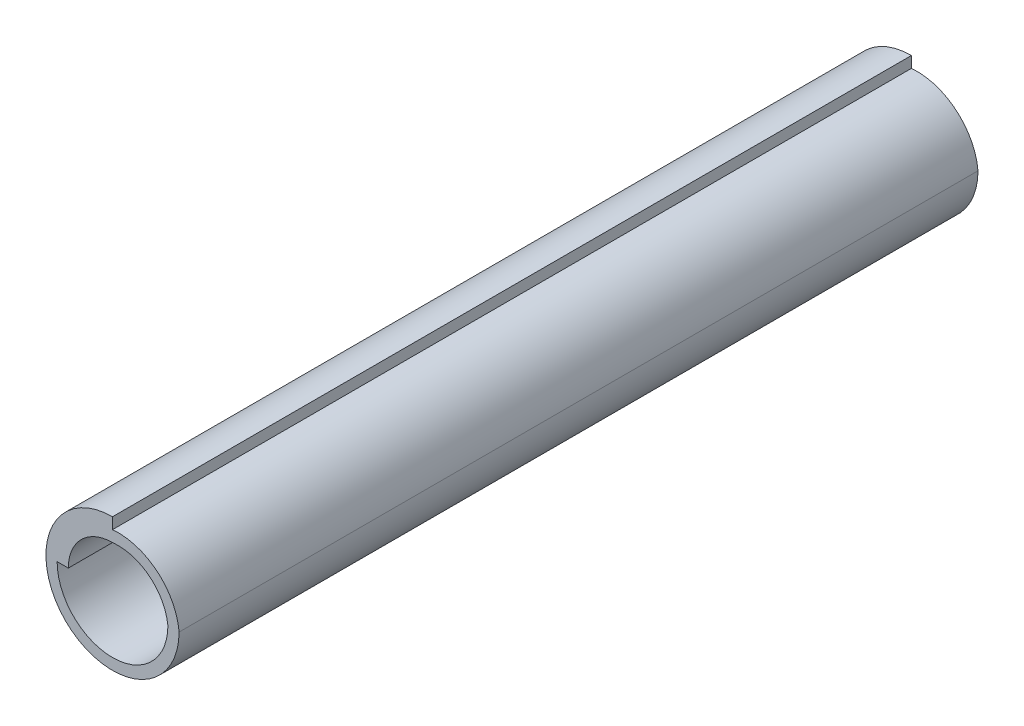
ISO-10303-21;
HEADER;
FILE_DESCRIPTION(('STEP AP214'),'2;1');
FILE_NAME('part.step','',(''),(''),'','','');
FILE_SCHEMA(('AUTOMOTIVE_DESIGN { 1 0 10303 214 1 1 1 1 }'));
ENDSEC;
DATA;
#1=APPLICATION_CONTEXT('core data for automotive mechanical design processes');
#2=APPLICATION_PROTOCOL_DEFINITION('international standard','automotive_design',2000,#1);
#3=PRODUCT_CONTEXT('',#1,'mechanical');
#4=PRODUCT('Part','Part','',(#3));
#5=PRODUCT_RELATED_PRODUCT_CATEGORY('part','',(#4));
#6=PRODUCT_DEFINITION_FORMATION('','',#4);
#7=PRODUCT_DEFINITION_CONTEXT('part definition',#1,'design');
#8=PRODUCT_DEFINITION('design','',#6,#7);
#9=PRODUCT_DEFINITION_SHAPE('','',#8);
#10=(LENGTH_UNIT() NAMED_UNIT(*) SI_UNIT(.MILLI.,.METRE.));
#11=(NAMED_UNIT(*) PLANE_ANGLE_UNIT() SI_UNIT($,.RADIAN.));
#12=(NAMED_UNIT(*) SI_UNIT($,.STERADIAN.) SOLID_ANGLE_UNIT());
#13=UNCERTAINTY_MEASURE_WITH_UNIT(LENGTH_MEASURE(1.E-05),#10,'distance_accuracy_value','');
#14=(GEOMETRIC_REPRESENTATION_CONTEXT(3) GLOBAL_UNCERTAINTY_ASSIGNED_CONTEXT((#13)) GLOBAL_UNIT_ASSIGNED_CONTEXT((#10,
#11,#12)) REPRESENTATION_CONTEXT('',''));
#15=CARTESIAN_POINT('',(0.,0.,0.));
#16=DIRECTION('',(0.,0.,1.));
#17=DIRECTION('',(1.,0.,0.));
#18=AXIS2_PLACEMENT_3D('',#15,#16,#17);
#19=CARTESIAN_POINT('',(0.209999999999992,-0.21000000000001,15.));
#20=DIRECTION('',(0.,0.,1.));
#21=DIRECTION('',(1.,0.,0.));
#22=AXIS2_PLACEMENT_3D('',#19,#20,#21);
#23=PLANE('',#22);
#24=CARTESIAN_POINT('',(0.209999999999992,-0.21000000000001,15.));
#25=DIRECTION('',(0.,0.,1.));
#26=DIRECTION('',(1.,0.,0.));
#27=AXIS2_PLACEMENT_3D('',#24,#25,#26);
#28=CIRCLE('',#27,2.29960866235976);
#29=CARTESIAN_POINT('',(2.5,0.,15.));
#30=VERTEX_POINT('',#29);
#31=CARTESIAN_POINT('',(0.,2.08,15.));
#32=VERTEX_POINT('',#31);
#33=EDGE_CURVE('E127',#30,#32,#28,.T.);
#34=ORIENTED_EDGE('',*,*,#33,.T.);
#35=DIRECTION('',(0.,1.,0.));
#36=VECTOR('',#35,1.);
#37=CARTESIAN_POINT('',(0.,2.08,15.));
#38=LINE('',#37,#36);
#39=CARTESIAN_POINT('',(0.,2.5,15.));
#40=VERTEX_POINT('',#39);
#41=EDGE_CURVE('E130',#32,#40,#38,.T.);
#42=ORIENTED_EDGE('',*,*,#41,.T.);
#43=CARTESIAN_POINT('',(0.,0.,15.));
#44=DIRECTION('',(0.,0.,1.));
#45=DIRECTION('',(1.,0.,0.));
#46=AXIS2_PLACEMENT_3D('',#43,#44,#45);
#47=CIRCLE('',#46,2.5);
#48=EDGE_CURVE('E133',#40,#30,#47,.T.);
#49=ORIENTED_EDGE('',*,*,#48,.T.);
#50=EDGE_LOOP('',(#34,#42,#49));
#51=FACE_BOUND('',#50,.T.);
#52=CARTESIAN_POINT('',(0.209999999999992,-0.21000000000001,15.));
#53=DIRECTION('',(0.,0.,1.));
#54=DIRECTION('',(1.,0.,0.));
#55=AXIS2_PLACEMENT_3D('',#52,#53,#54);
#56=CIRCLE('',#55,1.88175450045962);
#57=CARTESIAN_POINT('',(2.08,0.,15.));
#58=VERTEX_POINT('',#57);
#59=CARTESIAN_POINT('',(0.,1.66,15.));
#60=VERTEX_POINT('',#59);
#61=EDGE_CURVE('E99',#58,#60,#56,.T.);
#62=ORIENTED_EDGE('',*,*,#61,.F.);
#63=CARTESIAN_POINT('',(0.,0.,15.));
#64=DIRECTION('',(0.,0.,1.));
#65=DIRECTION('',(1.,0.,0.));
#66=AXIS2_PLACEMENT_3D('',#63,#64,#65);
#67=CIRCLE('',#66,2.08);
#68=CARTESIAN_POINT('',(-2.08,0.,15.));
#69=VERTEX_POINT('',#68);
#70=EDGE_CURVE('E91',#69,#58,#67,.T.);
#71=ORIENTED_EDGE('',*,*,#70,.F.);
#72=DIRECTION('',(-1.,0.,0.));
#73=VECTOR('',#72,1.);
#74=CARTESIAN_POINT('',(-2.08,0.,15.));
#75=LINE('',#74,#73);
#76=CARTESIAN_POINT('',(-1.66,0.,15.));
#77=VERTEX_POINT('',#76);
#78=EDGE_CURVE('E113',#77,#69,#75,.T.);
#79=ORIENTED_EDGE('',*,*,#78,.F.);
#80=CARTESIAN_POINT('',(0.,0.,15.));
#81=DIRECTION('',(0.,0.,1.));
#82=DIRECTION('',(1.,0.,0.));
#83=AXIS2_PLACEMENT_3D('',#80,#81,#82);
#84=CIRCLE('',#83,1.66);
#85=EDGE_CURVE('E111',#60,#77,#84,.T.);
#86=ORIENTED_EDGE('',*,*,#85,.F.);
#87=EDGE_LOOP('',(#62,#71,#79,#86));
#88=FACE_BOUND('',#87,.T.);
#89=ADVANCED_FACE('F32',(#51,#88),#23,.T.);
#90=CARTESIAN_POINT('',(0.209999999999992,-0.21000000000001,-15.));
#91=DIRECTION('',(0.,0.,1.));
#92=DIRECTION('',(1.,0.,0.));
#93=AXIS2_PLACEMENT_3D('',#90,#91,#92);
#94=PLANE('',#93);
#95=CARTESIAN_POINT('',(0.209999999999992,-0.21000000000001,-15.));
#96=DIRECTION('',(0.,0.,1.));
#97=DIRECTION('',(1.,0.,0.));
#98=AXIS2_PLACEMENT_3D('',#95,#96,#97);
#99=CIRCLE('',#98,2.29960866235976);
#100=CARTESIAN_POINT('',(2.5,0.,-15.));
#101=VERTEX_POINT('',#100);
#102=CARTESIAN_POINT('',(0.,2.08,-15.));
#103=VERTEX_POINT('',#102);
#104=EDGE_CURVE('E107',#101,#103,#99,.T.);
#105=ORIENTED_EDGE('',*,*,#104,.F.);
#106=CARTESIAN_POINT('',(0.,0.,-15.));
#107=DIRECTION('',(0.,0.,1.));
#108=DIRECTION('',(1.,0.,0.));
#109=AXIS2_PLACEMENT_3D('',#106,#107,#108);
#110=CIRCLE('',#109,2.5);
#111=CARTESIAN_POINT('',(0.,2.5,-15.));
#112=VERTEX_POINT('',#111);
#113=EDGE_CURVE('E131',#112,#101,#110,.T.);
#114=ORIENTED_EDGE('',*,*,#113,.F.);
#115=DIRECTION('',(0.,1.,0.));
#116=VECTOR('',#115,1.);
#117=CARTESIAN_POINT('',(0.,2.08,-15.));
#118=LINE('',#117,#116);
#119=EDGE_CURVE('E138',#103,#112,#118,.T.);
#120=ORIENTED_EDGE('',*,*,#119,.F.);
#121=EDGE_LOOP('',(#105,#114,#120));
#122=FACE_BOUND('',#121,.T.);
#123=CARTESIAN_POINT('',(0.,0.,-15.));
#124=DIRECTION('',(0.,0.,1.));
#125=DIRECTION('',(1.,0.,0.));
#126=AXIS2_PLACEMENT_3D('',#123,#124,#125);
#127=CIRCLE('',#126,2.08);
#128=CARTESIAN_POINT('',(-2.08,0.,-15.));
#129=VERTEX_POINT('',#128);
#130=CARTESIAN_POINT('',(2.08,0.,-15.));
#131=VERTEX_POINT('',#130);
#132=EDGE_CURVE('E55',#129,#131,#127,.T.);
#133=ORIENTED_EDGE('',*,*,#132,.T.);
#134=CARTESIAN_POINT('',(0.209999999999992,-0.21000000000001,-15.));
#135=DIRECTION('',(0.,0.,1.));
#136=DIRECTION('',(1.,0.,0.));
#137=AXIS2_PLACEMENT_3D('',#134,#135,#136);
#138=CIRCLE('',#137,1.88175450045962);
#139=CARTESIAN_POINT('',(0.,1.66,-15.));
#140=VERTEX_POINT('',#139);
#141=EDGE_CURVE('E106',#131,#140,#138,.T.);
#142=ORIENTED_EDGE('',*,*,#141,.T.);
#143=CARTESIAN_POINT('',(0.,0.,-15.));
#144=DIRECTION('',(0.,0.,1.));
#145=DIRECTION('',(1.,0.,0.));
#146=AXIS2_PLACEMENT_3D('',#143,#144,#145);
#147=CIRCLE('',#146,1.66);
#148=CARTESIAN_POINT('',(-1.66,0.,-15.));
#149=VERTEX_POINT('',#148);
#150=EDGE_CURVE('E119',#140,#149,#147,.T.);
#151=ORIENTED_EDGE('',*,*,#150,.T.);
#152=DIRECTION('',(-1.,0.,0.));
#153=VECTOR('',#152,1.);
#154=CARTESIAN_POINT('',(-2.08,0.,-15.));
#155=LINE('',#154,#153);
#156=EDGE_CURVE('E100',#149,#129,#155,.T.);
#157=ORIENTED_EDGE('',*,*,#156,.T.);
#158=EDGE_LOOP('',(#133,#142,#151,#157));
#159=FACE_BOUND('',#158,.T.);
#160=ADVANCED_FACE('F152',(#122,#159),#94,.F.);
#161=CARTESIAN_POINT('',(0.209999999999992,-0.21000000000001,15.));
#162=DIRECTION('',(0.,0.,-1.));
#163=DIRECTION('',(-1.,0.,0.));
#164=AXIS2_PLACEMENT_3D('',#161,#162,#163);
#165=CYLINDRICAL_SURFACE('',#164,2.29960866235976);
#166=ORIENTED_EDGE('',*,*,#104,.T.);
#167=DIRECTION('',(0.,0.,-1.));
#168=VECTOR('',#167,1.);
#169=CARTESIAN_POINT('',(0.,2.08,15.));
#170=LINE('',#169,#168);
#171=EDGE_CURVE('E11',#32,#103,#170,.T.);
#172=ORIENTED_EDGE('',*,*,#171,.F.);
#173=ORIENTED_EDGE('',*,*,#33,.F.);
#174=DIRECTION('',(0.,0.,-1.));
#175=VECTOR('',#174,1.);
#176=CARTESIAN_POINT('',(2.5,0.,15.));
#177=LINE('',#176,#175);
#178=EDGE_CURVE('E135',#30,#101,#177,.T.);
#179=ORIENTED_EDGE('',*,*,#178,.T.);
#180=EDGE_LOOP('',(#166,#172,#173,#179));
#181=FACE_BOUND('',#180,.T.);
#182=ADVANCED_FACE('F34',(#181),#165,.T.);
#183=CARTESIAN_POINT('',(0.,2.08,15.));
#184=DIRECTION('',(-1.,0.,0.));
#185=DIRECTION('',(0.,0.,1.));
#186=AXIS2_PLACEMENT_3D('',#183,#184,#185);
#187=PLANE('',#186);
#188=ORIENTED_EDGE('',*,*,#119,.T.);
#189=DIRECTION('',(0.,0.,-1.));
#190=VECTOR('',#189,1.);
#191=CARTESIAN_POINT('',(0.,2.5,15.));
#192=LINE('',#191,#190);
#193=EDGE_CURVE('E40',#40,#112,#192,.T.);
#194=ORIENTED_EDGE('',*,*,#193,.F.);
#195=ORIENTED_EDGE('',*,*,#41,.F.);
#196=ORIENTED_EDGE('',*,*,#171,.T.);
#197=EDGE_LOOP('',(#188,#194,#195,#196));
#198=FACE_BOUND('',#197,.T.);
#199=ADVANCED_FACE('F158',(#198),#187,.F.);
#200=CARTESIAN_POINT('',(0.,0.,15.));
#201=DIRECTION('',(0.,0.,-1.));
#202=DIRECTION('',(-1.,0.,0.));
#203=AXIS2_PLACEMENT_3D('',#200,#201,#202);
#204=CYLINDRICAL_SURFACE('',#203,2.5);
#205=ORIENTED_EDGE('',*,*,#113,.T.);
#206=ORIENTED_EDGE('',*,*,#178,.F.);
#207=ORIENTED_EDGE('',*,*,#48,.F.);
#208=ORIENTED_EDGE('',*,*,#193,.T.);
#209=EDGE_LOOP('',(#205,#206,#207,#208));
#210=FACE_BOUND('',#209,.T.);
#211=ADVANCED_FACE('F147',(#210),#204,.T.);
#212=CARTESIAN_POINT('',(0.,0.,15.));
#213=DIRECTION('',(0.,0.,-1.));
#214=DIRECTION('',(-1.,0.,0.));
#215=AXIS2_PLACEMENT_3D('',#212,#213,#214);
#216=CYLINDRICAL_SURFACE('',#215,2.08);
#217=ORIENTED_EDGE('',*,*,#132,.F.);
#218=DIRECTION('',(0.,0.,-1.));
#219=VECTOR('',#218,1.);
#220=CARTESIAN_POINT('',(-2.08,0.,15.));
#221=LINE('',#220,#219);
#222=EDGE_CURVE('E95',#69,#129,#221,.T.);
#223=ORIENTED_EDGE('',*,*,#222,.F.);
#224=ORIENTED_EDGE('',*,*,#70,.T.);
#225=DIRECTION('',(0.,0.,-1.));
#226=VECTOR('',#225,1.);
#227=CARTESIAN_POINT('',(2.08,0.,15.));
#228=LINE('',#227,#226);
#229=EDGE_CURVE('E94',#58,#131,#228,.T.);
#230=ORIENTED_EDGE('',*,*,#229,.T.);
#231=EDGE_LOOP('',(#217,#223,#224,#230));
#232=FACE_BOUND('',#231,.T.);
#233=ADVANCED_FACE('F93',(#232),#216,.F.);
#234=CARTESIAN_POINT('',(0.209999999999992,-0.21000000000001,15.));
#235=DIRECTION('',(0.,0.,-1.));
#236=DIRECTION('',(-1.,0.,0.));
#237=AXIS2_PLACEMENT_3D('',#234,#235,#236);
#238=CYLINDRICAL_SURFACE('',#237,1.88175450045962);
#239=ORIENTED_EDGE('',*,*,#141,.F.);
#240=ORIENTED_EDGE('',*,*,#229,.F.);
#241=ORIENTED_EDGE('',*,*,#61,.T.);
#242=DIRECTION('',(0.,0.,-1.));
#243=VECTOR('',#242,1.);
#244=CARTESIAN_POINT('',(0.,1.66,15.));
#245=LINE('',#244,#243);
#246=EDGE_CURVE('E108',#60,#140,#245,.T.);
#247=ORIENTED_EDGE('',*,*,#246,.T.);
#248=EDGE_LOOP('',(#239,#240,#241,#247));
#249=FACE_BOUND('',#248,.T.);
#250=ADVANCED_FACE('F103',(#249),#238,.F.);
#251=CARTESIAN_POINT('',(0.,0.,15.));
#252=DIRECTION('',(0.,0.,-1.));
#253=DIRECTION('',(-1.,0.,0.));
#254=AXIS2_PLACEMENT_3D('',#251,#252,#253);
#255=CYLINDRICAL_SURFACE('',#254,1.66);
#256=ORIENTED_EDGE('',*,*,#150,.F.);
#257=ORIENTED_EDGE('',*,*,#246,.F.);
#258=ORIENTED_EDGE('',*,*,#85,.T.);
#259=DIRECTION('',(0.,0.,-1.));
#260=VECTOR('',#259,1.);
#261=CARTESIAN_POINT('',(-1.66,0.,15.));
#262=LINE('',#261,#260);
#263=EDGE_CURVE('E47',#77,#149,#262,.T.);
#264=ORIENTED_EDGE('',*,*,#263,.T.);
#265=EDGE_LOOP('',(#256,#257,#258,#264));
#266=FACE_BOUND('',#265,.T.);
#267=ADVANCED_FACE('F176',(#266),#255,.F.);
#268=CARTESIAN_POINT('',(-2.08,0.,15.));
#269=DIRECTION('',(0.,-1.,0.));
#270=DIRECTION('',(0.,0.,-1.));
#271=AXIS2_PLACEMENT_3D('',#268,#269,#270);
#272=PLANE('',#271);
#273=ORIENTED_EDGE('',*,*,#156,.F.);
#274=ORIENTED_EDGE('',*,*,#263,.F.);
#275=ORIENTED_EDGE('',*,*,#78,.T.);
#276=ORIENTED_EDGE('',*,*,#222,.T.);
#277=EDGE_LOOP('',(#273,#274,#275,#276));
#278=FACE_BOUND('',#277,.T.);
#279=ADVANCED_FACE('F179',(#278),#272,.T.);
#280=CLOSED_SHELL('',(#89,#160,#182,#199,#211,#233,#250,#267,#279));
#281=MANIFOLD_SOLID_BREP('B2',#280);
#282=ADVANCED_BREP_SHAPE_REPRESENTATION('',(#18,#281),#14);
#283=SHAPE_DEFINITION_REPRESENTATION(#9,#282);
ENDSEC;
END-ISO-10303-21;
